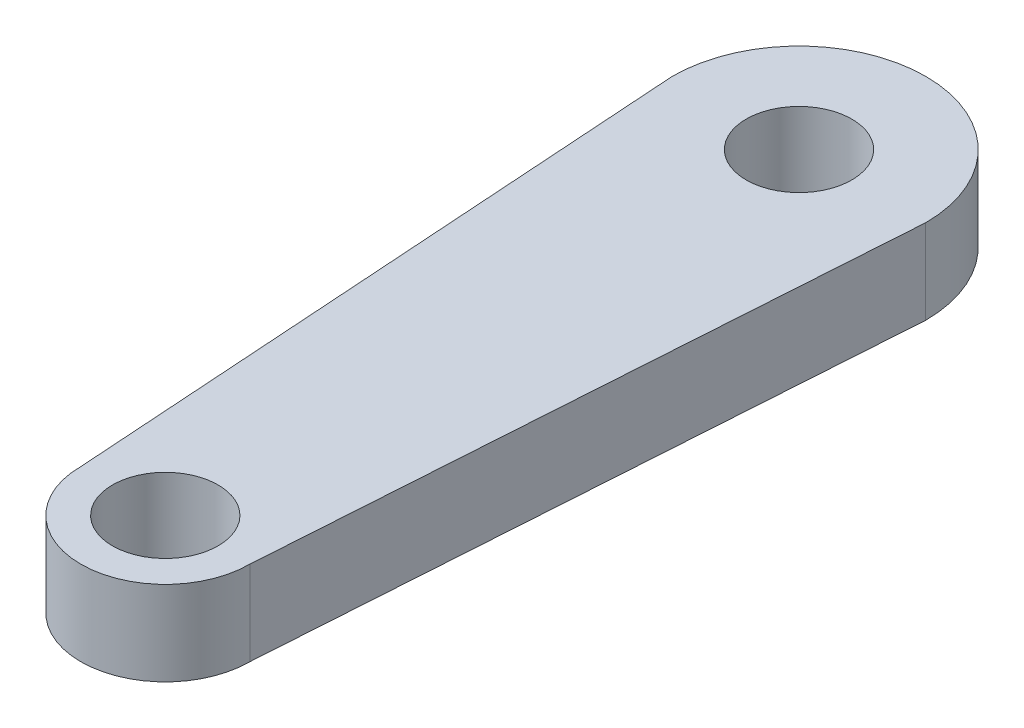
ISO-10303-21;
HEADER;
FILE_DESCRIPTION(('STEP AP214'),'2;1');
FILE_NAME('part.step','',(''),(''),'','','');
FILE_SCHEMA(('AUTOMOTIVE_DESIGN { 1 0 10303 214 1 1 1 1 }'));
ENDSEC;
DATA;
#1=APPLICATION_CONTEXT('core data for automotive mechanical design processes');
#2=APPLICATION_PROTOCOL_DEFINITION('international standard','automotive_design',2000,#1);
#3=PRODUCT_CONTEXT('',#1,'mechanical');
#4=PRODUCT('Part','Part','',(#3));
#5=PRODUCT_RELATED_PRODUCT_CATEGORY('part','',(#4));
#6=PRODUCT_DEFINITION_FORMATION('','',#4);
#7=PRODUCT_DEFINITION_CONTEXT('part definition',#1,'design');
#8=PRODUCT_DEFINITION('design','',#6,#7);
#9=PRODUCT_DEFINITION_SHAPE('','',#8);
#10=(LENGTH_UNIT() NAMED_UNIT(*) SI_UNIT(.MILLI.,.METRE.));
#11=(NAMED_UNIT(*) PLANE_ANGLE_UNIT() SI_UNIT($,.RADIAN.));
#12=(NAMED_UNIT(*) SI_UNIT($,.STERADIAN.) SOLID_ANGLE_UNIT());
#13=UNCERTAINTY_MEASURE_WITH_UNIT(LENGTH_MEASURE(1.E-05),#10,'distance_accuracy_value','');
#14=(GEOMETRIC_REPRESENTATION_CONTEXT(3) GLOBAL_UNCERTAINTY_ASSIGNED_CONTEXT((#13)) GLOBAL_UNIT_ASSIGNED_CONTEXT((#10,
#11,#12)) REPRESENTATION_CONTEXT('',''));
#15=CARTESIAN_POINT('',(0.,0.,0.));
#16=DIRECTION('',(0.,0.,1.));
#17=DIRECTION('',(1.,0.,0.));
#18=AXIS2_PLACEMENT_3D('',#15,#16,#17);
#19=CARTESIAN_POINT('',(-2.65486725663717,1.,0.176991150442478));
#20=DIRECTION('',(0.997785157856609,0.,-0.066519010523774));
#21=DIRECTION('',(-0.066519010523774,0.,-0.997785157856609));
#22=AXIS2_PLACEMENT_3D('',#19,#20,#21);
#23=PLANE('',#22);
#24=DIRECTION('',(0.066519010523774,0.,0.997785157856609));
#25=VECTOR('',#24,1.);
#26=CARTESIAN_POINT('',(-2.65486725663717,-1.,0.176991150442478));
#27=LINE('',#26,#25);
#28=CARTESIAN_POINT('',(-3.,-1.,-5.));
#29=VERTEX_POINT('',#28);
#30=CARTESIAN_POINT('',(-2.,-1.,10.));
#31=VERTEX_POINT('',#30);
#32=EDGE_CURVE('E121',#29,#31,#27,.T.);
#33=ORIENTED_EDGE('',*,*,#32,.T.);
#34=DIRECTION('',(0.,-1.,0.));
#35=VECTOR('',#34,1.);
#36=CARTESIAN_POINT('',(-2.,1.,10.));
#37=LINE('',#36,#35);
#38=CARTESIAN_POINT('',(-2.,1.,10.));
#39=VERTEX_POINT('',#38);
#40=EDGE_CURVE('E11',#39,#31,#37,.T.);
#41=ORIENTED_EDGE('',*,*,#40,.F.);
#42=DIRECTION('',(0.066519010523774,0.,0.997785157856609));
#43=VECTOR('',#42,1.);
#44=CARTESIAN_POINT('',(-2.65486725663717,1.,0.176991150442478));
#45=LINE('',#44,#43);
#46=CARTESIAN_POINT('',(-3.,1.,-5.));
#47=VERTEX_POINT('',#46);
#48=EDGE_CURVE('E94',#47,#39,#45,.T.);
#49=ORIENTED_EDGE('',*,*,#48,.F.);
#50=DIRECTION('',(0.,-1.,0.));
#51=VECTOR('',#50,1.);
#52=CARTESIAN_POINT('',(-3.,1.,-5.));
#53=LINE('',#52,#51);
#54=EDGE_CURVE('E109',#47,#29,#53,.T.);
#55=ORIENTED_EDGE('',*,*,#54,.T.);
#56=EDGE_LOOP('',(#33,#41,#49,#55));
#57=FACE_BOUND('',#56,.T.);
#58=ADVANCED_FACE('F45',(#57),#23,.F.);
#59=CARTESIAN_POINT('',(0.,1.,10.));
#60=DIRECTION('',(0.,-1.,0.));
#61=DIRECTION('',(0.,0.,-1.));
#62=AXIS2_PLACEMENT_3D('',#59,#60,#61);
#63=CYLINDRICAL_SURFACE('',#62,2.);
#64=CARTESIAN_POINT('',(0.,-1.,10.));
#65=DIRECTION('',(0.,1.,0.));
#66=DIRECTION('',(0.,0.,1.));
#67=AXIS2_PLACEMENT_3D('',#64,#65,#66);
#68=CIRCLE('',#67,2.);
#69=CARTESIAN_POINT('',(2.,-1.,10.));
#70=VERTEX_POINT('',#69);
#71=EDGE_CURVE('E100',#31,#70,#68,.T.);
#72=ORIENTED_EDGE('',*,*,#71,.T.);
#73=DIRECTION('',(0.,-1.,0.));
#74=VECTOR('',#73,1.);
#75=CARTESIAN_POINT('',(2.,1.,10.));
#76=LINE('',#75,#74);
#77=CARTESIAN_POINT('',(2.,1.,10.));
#78=VERTEX_POINT('',#77);
#79=EDGE_CURVE('E55',#78,#70,#76,.T.);
#80=ORIENTED_EDGE('',*,*,#79,.F.);
#81=CARTESIAN_POINT('',(0.,1.,10.));
#82=DIRECTION('',(0.,1.,0.));
#83=DIRECTION('',(0.,0.,1.));
#84=AXIS2_PLACEMENT_3D('',#81,#82,#83);
#85=CIRCLE('',#84,2.);
#86=EDGE_CURVE('E89',#39,#78,#85,.T.);
#87=ORIENTED_EDGE('',*,*,#86,.F.);
#88=ORIENTED_EDGE('',*,*,#40,.T.);
#89=EDGE_LOOP('',(#72,#80,#87,#88));
#90=FACE_BOUND('',#89,.T.);
#91=ADVANCED_FACE('F99',(#90),#63,.T.);
#92=CARTESIAN_POINT('',(2.65486725663716,1.,0.176991150442477));
#93=DIRECTION('',(0.997785157856609,0.,0.0665190105237738));
#94=DIRECTION('',(0.0665190105237738,0.,-0.997785157856609));
#95=AXIS2_PLACEMENT_3D('',#92,#93,#94);
#96=PLANE('',#95);
#97=DIRECTION('',(-0.0665190105237738,0.,0.997785157856609));
#98=VECTOR('',#97,1.);
#99=CARTESIAN_POINT('',(2.65486725663716,-1.,0.176991150442477));
#100=LINE('',#99,#98);
#101=CARTESIAN_POINT('',(2.99999999999999,-1.,-5.));
#102=VERTEX_POINT('',#101);
#103=EDGE_CURVE('E127',#102,#70,#100,.T.);
#104=ORIENTED_EDGE('',*,*,#103,.F.);
#105=DIRECTION('',(0.,-1.,0.));
#106=VECTOR('',#105,1.);
#107=CARTESIAN_POINT('',(2.99999999999999,1.,-5.));
#108=LINE('',#107,#106);
#109=CARTESIAN_POINT('',(2.99999999999999,1.,-5.));
#110=VERTEX_POINT('',#109);
#111=EDGE_CURVE('E79',#110,#102,#108,.T.);
#112=ORIENTED_EDGE('',*,*,#111,.F.);
#113=DIRECTION('',(-0.0665190105237738,0.,0.997785157856609));
#114=VECTOR('',#113,1.);
#115=CARTESIAN_POINT('',(2.65486725663716,1.,0.176991150442477));
#116=LINE('',#115,#114);
#117=EDGE_CURVE('E92',#110,#78,#116,.T.);
#118=ORIENTED_EDGE('',*,*,#117,.T.);
#119=ORIENTED_EDGE('',*,*,#79,.T.);
#120=EDGE_LOOP('',(#104,#112,#118,#119));
#121=FACE_BOUND('',#120,.T.);
#122=ADVANCED_FACE('F105',(#121),#96,.T.);
#123=CARTESIAN_POINT('',(0.,1.,-5.));
#124=DIRECTION('',(0.,-1.,0.));
#125=DIRECTION('',(0.,0.,-1.));
#126=AXIS2_PLACEMENT_3D('',#123,#124,#125);
#127=CYLINDRICAL_SURFACE('',#126,1.25);
#128=CARTESIAN_POINT('',(0.,1.,-5.));
#129=DIRECTION('',(0.,1.,0.));
#130=DIRECTION('',(0.,0.,1.));
#131=AXIS2_PLACEMENT_3D('',#128,#129,#130);
#132=CIRCLE('',#131,1.25);
#133=CARTESIAN_POINT('',(0.,1.,-3.75));
#134=VERTEX_POINT('',#133);
#135=EDGE_CURVE('E169',#134,#134,#132,.T.);
#136=ORIENTED_EDGE('',*,*,#135,.T.);
#137=EDGE_LOOP('',(#136));
#138=FACE_BOUND('',#137,.T.);
#139=CARTESIAN_POINT('',(0.,-1.,-5.));
#140=DIRECTION('',(0.,1.,0.));
#141=DIRECTION('',(0.,0.,1.));
#142=AXIS2_PLACEMENT_3D('',#139,#140,#141);
#143=CIRCLE('',#142,1.25);
#144=CARTESIAN_POINT('',(0.,-1.,-3.75));
#145=VERTEX_POINT('',#144);
#146=EDGE_CURVE('E117',#145,#145,#143,.T.);
#147=ORIENTED_EDGE('',*,*,#146,.F.);
#148=EDGE_LOOP('',(#147));
#149=FACE_BOUND('',#148,.T.);
#150=ADVANCED_FACE('F158',(#138,#149),#127,.F.);
#151=CARTESIAN_POINT('',(0.,1.,10.));
#152=DIRECTION('',(0.,-1.,0.));
#153=DIRECTION('',(0.,0.,-1.));
#154=AXIS2_PLACEMENT_3D('',#151,#152,#153);
#155=CYLINDRICAL_SURFACE('',#154,1.25);
#156=CARTESIAN_POINT('',(0.,1.,10.));
#157=DIRECTION('',(0.,1.,0.));
#158=DIRECTION('',(0.,0.,1.));
#159=AXIS2_PLACEMENT_3D('',#156,#157,#158);
#160=CIRCLE('',#159,1.25);
#161=CARTESIAN_POINT('',(0.,1.,11.25));
#162=VERTEX_POINT('',#161);
#163=EDGE_CURVE('E132',#162,#162,#160,.T.);
#164=ORIENTED_EDGE('',*,*,#163,.T.);
#165=EDGE_LOOP('',(#164));
#166=FACE_BOUND('',#165,.T.);
#167=CARTESIAN_POINT('',(0.,-1.,10.));
#168=DIRECTION('',(0.,1.,0.));
#169=DIRECTION('',(0.,0.,1.));
#170=AXIS2_PLACEMENT_3D('',#167,#168,#169);
#171=CIRCLE('',#170,1.25);
#172=CARTESIAN_POINT('',(0.,-1.,11.25));
#173=VERTEX_POINT('',#172);
#174=EDGE_CURVE('E113',#173,#173,#171,.T.);
#175=ORIENTED_EDGE('',*,*,#174,.F.);
#176=EDGE_LOOP('',(#175));
#177=FACE_BOUND('',#176,.T.);
#178=ADVANCED_FACE('F47',(#166,#177),#155,.F.);
#179=CARTESIAN_POINT('',(0.,1.,-5.));
#180=DIRECTION('',(0.,-1.,0.));
#181=DIRECTION('',(0.,0.,-1.));
#182=AXIS2_PLACEMENT_3D('',#179,#180,#181);
#183=CYLINDRICAL_SURFACE('',#182,3.);
#184=CARTESIAN_POINT('',(0.,-1.,-5.));
#185=DIRECTION('',(0.,1.,0.));
#186=DIRECTION('',(0.,0.,1.));
#187=AXIS2_PLACEMENT_3D('',#184,#185,#186);
#188=CIRCLE('',#187,3.);
#189=EDGE_CURVE('E82',#102,#29,#188,.T.);
#190=ORIENTED_EDGE('',*,*,#189,.T.);
#191=ORIENTED_EDGE('',*,*,#54,.F.);
#192=CARTESIAN_POINT('',(0.,1.,-5.));
#193=DIRECTION('',(0.,1.,0.));
#194=DIRECTION('',(0.,0.,1.));
#195=AXIS2_PLACEMENT_3D('',#192,#193,#194);
#196=CIRCLE('',#195,3.);
#197=EDGE_CURVE('E63',#110,#47,#196,.T.);
#198=ORIENTED_EDGE('',*,*,#197,.F.);
#199=ORIENTED_EDGE('',*,*,#111,.T.);
#200=EDGE_LOOP('',(#190,#191,#198,#199));
#201=FACE_BOUND('',#200,.T.);
#202=ADVANCED_FACE('F146',(#201),#183,.T.);
#203=CARTESIAN_POINT('',(0.,1.,0.));
#204=DIRECTION('',(0.,1.,0.));
#205=DIRECTION('',(0.,0.,1.));
#206=AXIS2_PLACEMENT_3D('',#203,#204,#205);
#207=PLANE('',#206);
#208=ORIENTED_EDGE('',*,*,#163,.F.);
#209=EDGE_LOOP('',(#208));
#210=FACE_BOUND('',#209,.T.);
#211=ORIENTED_EDGE('',*,*,#135,.F.);
#212=EDGE_LOOP('',(#211));
#213=FACE_BOUND('',#212,.T.);
#214=ORIENTED_EDGE('',*,*,#48,.T.);
#215=ORIENTED_EDGE('',*,*,#86,.T.);
#216=ORIENTED_EDGE('',*,*,#117,.F.);
#217=ORIENTED_EDGE('',*,*,#197,.T.);
#218=EDGE_LOOP('',(#214,#215,#216,#217));
#219=FACE_BOUND('',#218,.T.);
#220=ADVANCED_FACE('F90',(#210,#213,#219),#207,.T.);
#221=CARTESIAN_POINT('',(0.,-1.,0.));
#222=DIRECTION('',(0.,1.,0.));
#223=DIRECTION('',(0.,0.,1.));
#224=AXIS2_PLACEMENT_3D('',#221,#222,#223);
#225=PLANE('',#224);
#226=ORIENTED_EDGE('',*,*,#174,.T.);
#227=EDGE_LOOP('',(#226));
#228=FACE_BOUND('',#227,.T.);
#229=ORIENTED_EDGE('',*,*,#146,.T.);
#230=EDGE_LOOP('',(#229));
#231=FACE_BOUND('',#230,.T.);
#232=ORIENTED_EDGE('',*,*,#32,.F.);
#233=ORIENTED_EDGE('',*,*,#189,.F.);
#234=ORIENTED_EDGE('',*,*,#103,.T.);
#235=ORIENTED_EDGE('',*,*,#71,.F.);
#236=EDGE_LOOP('',(#232,#233,#234,#235));
#237=FACE_BOUND('',#236,.T.);
#238=ADVANCED_FACE('F139',(#228,#231,#237),#225,.F.);
#239=CLOSED_SHELL('',(#58,#91,#122,#150,#178,#202,#220,#238));
#240=MANIFOLD_SOLID_BREP('B2',#239);
#241=ADVANCED_BREP_SHAPE_REPRESENTATION('',(#18,#240),#14);
#242=SHAPE_DEFINITION_REPRESENTATION(#9,#241);
ENDSEC;
END-ISO-10303-21;
